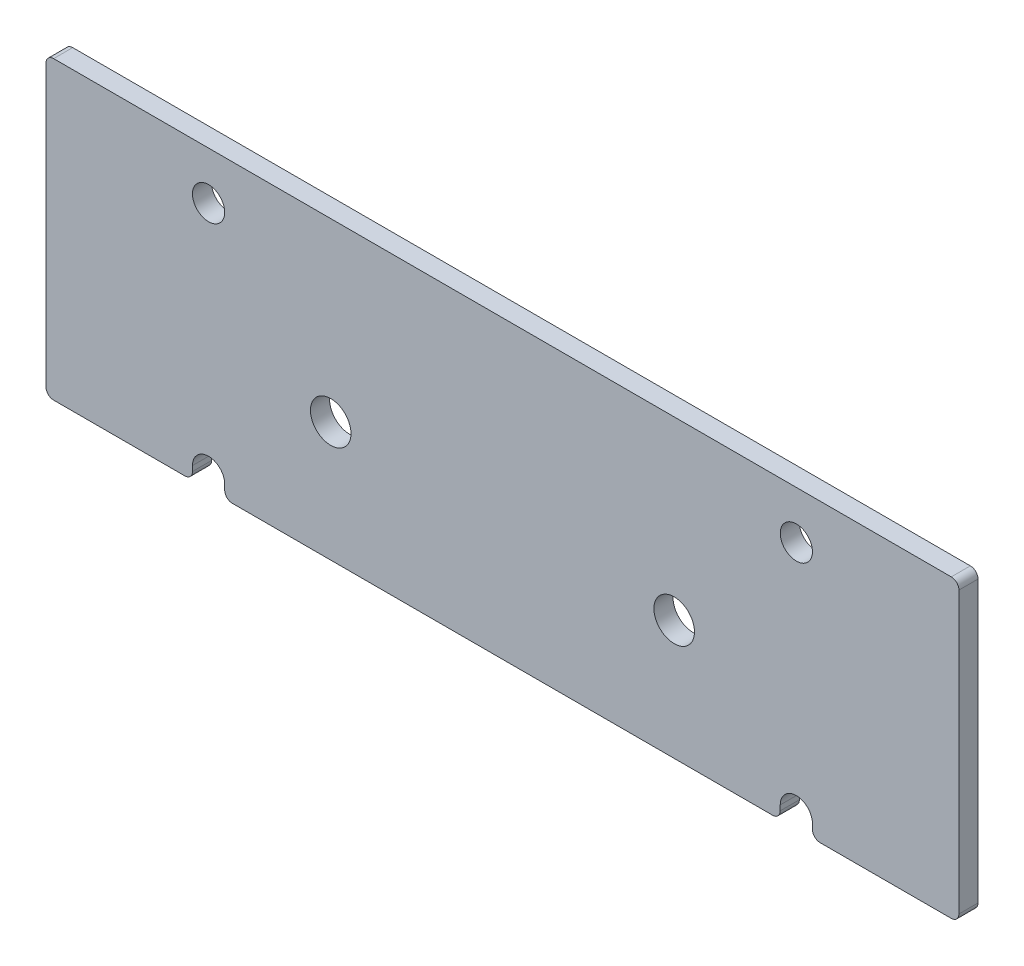
ISO-10303-21;
HEADER;
FILE_DESCRIPTION(('STEP AP214'),'2;1');
FILE_NAME('part.step','',(''),(''),'','','');
FILE_SCHEMA(('AUTOMOTIVE_DESIGN { 1 0 10303 214 1 1 1 1 }'));
ENDSEC;
DATA;
#1=APPLICATION_CONTEXT('core data for automotive mechanical design processes');
#2=APPLICATION_PROTOCOL_DEFINITION('international standard','automotive_design',2000,#1);
#3=PRODUCT_CONTEXT('',#1,'mechanical');
#4=PRODUCT('Part','Part','',(#3));
#5=PRODUCT_RELATED_PRODUCT_CATEGORY('part','',(#4));
#6=PRODUCT_DEFINITION_FORMATION('','',#4);
#7=PRODUCT_DEFINITION_CONTEXT('part definition',#1,'design');
#8=PRODUCT_DEFINITION('design','',#6,#7);
#9=PRODUCT_DEFINITION_SHAPE('','',#8);
#10=(LENGTH_UNIT() NAMED_UNIT(*) SI_UNIT(.MILLI.,.METRE.));
#11=(NAMED_UNIT(*) PLANE_ANGLE_UNIT() SI_UNIT($,.RADIAN.));
#12=(NAMED_UNIT(*) SI_UNIT($,.STERADIAN.) SOLID_ANGLE_UNIT());
#13=UNCERTAINTY_MEASURE_WITH_UNIT(LENGTH_MEASURE(1.E-05),#10,'distance_accuracy_value','');
#14=(GEOMETRIC_REPRESENTATION_CONTEXT(3) GLOBAL_UNCERTAINTY_ASSIGNED_CONTEXT((#13)) GLOBAL_UNIT_ASSIGNED_CONTEXT((#10,
#11,#12)) REPRESENTATION_CONTEXT('',''));
#15=CARTESIAN_POINT('',(0.,0.,0.));
#16=DIRECTION('',(0.,0.,1.));
#17=DIRECTION('',(1.,0.,0.));
#18=AXIS2_PLACEMENT_3D('',#15,#16,#17);
#19=CARTESIAN_POINT('',(97.7899999999999,34.29,6.35));
#20=DIRECTION('',(0.,0.,1.));
#21=DIRECTION('',(1.,0.,0.));
#22=AXIS2_PLACEMENT_3D('',#19,#20,#21);
#23=CYLINDRICAL_SURFACE('',#22,5.35787599999999);
#24=DIRECTION('',(0.,0.,1.));
#25=VECTOR('',#24,1.);
#26=CARTESIAN_POINT('',(103.147876,34.29,0.));
#27=LINE('',#26,#25);
#28=CARTESIAN_POINT('',(103.147876,34.29,0.));
#29=VERTEX_POINT('',#28);
#30=CARTESIAN_POINT('',(103.147876,34.29,6.35));
#31=VERTEX_POINT('',#30);
#32=EDGE_CURVE('E414',#29,#31,#27,.T.);
#33=ORIENTED_EDGE('',*,*,#32,.T.);
#34=CARTESIAN_POINT('',(97.7899999999999,34.29,6.35));
#35=DIRECTION('',(0.,0.,1.));
#36=DIRECTION('',(1.,0.,0.));
#37=AXIS2_PLACEMENT_3D('',#34,#35,#36);
#38=CIRCLE('',#37,5.35787599999998);
#39=CARTESIAN_POINT('',(92.4321239999999,34.29,6.35));
#40=VERTEX_POINT('',#39);
#41=EDGE_CURVE('E247',#31,#40,#38,.T.);
#42=ORIENTED_EDGE('',*,*,#41,.T.);
#43=DIRECTION('',(0.,0.,1.));
#44=VECTOR('',#43,1.);
#45=CARTESIAN_POINT('',(92.4321239999999,34.29,0.));
#46=LINE('',#45,#44);
#47=CARTESIAN_POINT('',(92.4321239999999,34.29,0.));
#48=VERTEX_POINT('',#47);
#49=EDGE_CURVE('E233',#48,#40,#46,.T.);
#50=ORIENTED_EDGE('',*,*,#49,.F.);
#51=CARTESIAN_POINT('',(97.7899999999999,34.29,0.));
#52=DIRECTION('',(0.,0.,1.));
#53=DIRECTION('',(1.,0.,0.));
#54=AXIS2_PLACEMENT_3D('',#51,#52,#53);
#55=CIRCLE('',#54,5.357876);
#56=EDGE_CURVE('E245',#29,#48,#55,.T.);
#57=ORIENTED_EDGE('',*,*,#56,.F.);
#58=EDGE_LOOP('',(#33,#42,#50,#57));
#59=FACE_BOUND('',#58,.T.);
#60=ADVANCED_FACE('F59',(#59),#23,.F.);
#61=CARTESIAN_POINT('',(-97.7899999999998,34.29,6.35));
#62=DIRECTION('',(0.,0.,1.));
#63=DIRECTION('',(1.,0.,0.));
#64=AXIS2_PLACEMENT_3D('',#61,#62,#63);
#65=CYLINDRICAL_SURFACE('',#64,5.35787599999999);
#66=CARTESIAN_POINT('',(-97.7899999999998,34.29,6.35));
#67=DIRECTION('',(0.,0.,1.));
#68=DIRECTION('',(1.,0.,0.));
#69=AXIS2_PLACEMENT_3D('',#66,#67,#68);
#70=CIRCLE('',#69,5.35787599999998);
#71=CARTESIAN_POINT('',(-92.4321239999999,34.29,6.35));
#72=VERTEX_POINT('',#71);
#73=CARTESIAN_POINT('',(-103.147876,34.29,6.35));
#74=VERTEX_POINT('',#73);
#75=EDGE_CURVE('E524',#72,#74,#70,.T.);
#76=ORIENTED_EDGE('',*,*,#75,.T.);
#77=DIRECTION('',(0.,0.,1.));
#78=VECTOR('',#77,1.);
#79=CARTESIAN_POINT('',(-103.147876,34.29,0.));
#80=LINE('',#79,#78);
#81=CARTESIAN_POINT('',(-103.147876,34.29,0.));
#82=VERTEX_POINT('',#81);
#83=EDGE_CURVE('E488',#82,#74,#80,.T.);
#84=ORIENTED_EDGE('',*,*,#83,.F.);
#85=CARTESIAN_POINT('',(-97.7899999999998,34.29,0.));
#86=DIRECTION('',(0.,0.,1.));
#87=DIRECTION('',(1.,0.,0.));
#88=AXIS2_PLACEMENT_3D('',#85,#86,#87);
#89=CIRCLE('',#88,5.357876);
#90=CARTESIAN_POINT('',(-92.4321239999999,34.29,0.));
#91=VERTEX_POINT('',#90);
#92=EDGE_CURVE('E519',#91,#82,#89,.T.);
#93=ORIENTED_EDGE('',*,*,#92,.F.);
#94=DIRECTION('',(0.,0.,1.));
#95=VECTOR('',#94,1.);
#96=CARTESIAN_POINT('',(-92.4321239999999,34.29,0.));
#97=LINE('',#96,#95);
#98=EDGE_CURVE('E502',#91,#72,#97,.T.);
#99=ORIENTED_EDGE('',*,*,#98,.T.);
#100=EDGE_LOOP('',(#76,#84,#93,#99));
#101=FACE_BOUND('',#100,.T.);
#102=ADVANCED_FACE('F609',(#101),#65,.F.);
#103=CARTESIAN_POINT('',(127.,-1.26999999999994,0.));
#104=DIRECTION('',(0.,0.,-1.));
#105=DIRECTION('',(-1.,0.,0.));
#106=AXIS2_PLACEMENT_3D('',#103,#104,#105);
#107=PLANE('',#106);
#108=DIRECTION('',(0.,-1.,0.));
#109=VECTOR('',#108,1.);
#110=CARTESIAN_POINT('',(151.892,128.458282570265,0.));
#111=LINE('',#110,#109);
#112=CARTESIAN_POINT('',(151.892,125.918282570265,0.));
#113=VERTEX_POINT('',#112);
#114=CARTESIAN_POINT('',(151.892,32.5732825702649,0.));
#115=VERTEX_POINT('',#114);
#116=EDGE_CURVE('E282',#113,#115,#111,.T.);
#117=ORIENTED_EDGE('',*,*,#116,.T.);
#118=CARTESIAN_POINT('',(149.352,32.5732825702649,0.));
#119=DIRECTION('',(0.,0.,-1.));
#120=DIRECTION('',(-1.,0.,0.));
#121=AXIS2_PLACEMENT_3D('',#118,#119,#120);
#122=CIRCLE('',#121,2.54);
#123=CARTESIAN_POINT('',(149.352,30.0332825702649,0.));
#124=VERTEX_POINT('',#123);
#125=EDGE_CURVE('E365',#115,#124,#122,.T.);
#126=ORIENTED_EDGE('',*,*,#125,.T.);
#127=DIRECTION('',(-1.,0.,0.));
#128=VECTOR('',#127,1.);
#129=CARTESIAN_POINT('',(-151.892,30.0332825702649,0.));
#130=LINE('',#129,#128);
#131=CARTESIAN_POINT('',(105.687876,30.0332825702649,0.));
#132=VERTEX_POINT('',#131);
#133=EDGE_CURVE('E423',#124,#132,#130,.T.);
#134=ORIENTED_EDGE('',*,*,#133,.T.);
#135=CARTESIAN_POINT('',(105.687876,32.5732825702649,0.));
#136=DIRECTION('',(0.,0.,-1.));
#137=DIRECTION('',(-1.,0.,0.));
#138=AXIS2_PLACEMENT_3D('',#135,#136,#137);
#139=CIRCLE('',#138,2.54);
#140=CARTESIAN_POINT('',(103.147876,32.5732825702649,0.));
#141=VERTEX_POINT('',#140);
#142=EDGE_CURVE('E351',#132,#141,#139,.T.);
#143=ORIENTED_EDGE('',*,*,#142,.T.);
#144=DIRECTION('',(0.,1.,0.));
#145=VECTOR('',#144,1.);
#146=CARTESIAN_POINT('',(103.147876,34.29,0.));
#147=LINE('',#146,#145);
#148=EDGE_CURVE('E255',#141,#29,#147,.T.);
#149=ORIENTED_EDGE('',*,*,#148,.T.);
#150=ORIENTED_EDGE('',*,*,#56,.T.);
#151=DIRECTION('',(0.,-1.,0.));
#152=VECTOR('',#151,1.);
#153=CARTESIAN_POINT('',(92.4321239999999,34.29,0.));
#154=LINE('',#153,#152);
#155=CARTESIAN_POINT('',(92.4321239999999,32.5732825702649,0.));
#156=VERTEX_POINT('',#155);
#157=EDGE_CURVE('E229',#48,#156,#154,.T.);
#158=ORIENTED_EDGE('',*,*,#157,.T.);
#159=CARTESIAN_POINT('',(89.8921239999999,32.5732825702649,0.));
#160=DIRECTION('',(0.,0.,-1.));
#161=DIRECTION('',(-1.,0.,0.));
#162=AXIS2_PLACEMENT_3D('',#159,#160,#161);
#163=CIRCLE('',#162,2.54);
#164=CARTESIAN_POINT('',(89.8921239999999,30.0332825702649,0.));
#165=VERTEX_POINT('',#164);
#166=EDGE_CURVE('E354',#156,#165,#163,.T.);
#167=ORIENTED_EDGE('',*,*,#166,.T.);
#168=CARTESIAN_POINT('',(-89.8921239999999,30.0332825702649,0.));
#169=VERTEX_POINT('',#168);
#170=EDGE_CURVE('E427',#165,#169,#130,.T.);
#171=ORIENTED_EDGE('',*,*,#170,.T.);
#172=CARTESIAN_POINT('',(-89.8921239999999,32.5732825702649,0.));
#173=DIRECTION('',(0.,0.,-1.));
#174=DIRECTION('',(-1.,0.,0.));
#175=AXIS2_PLACEMENT_3D('',#172,#173,#174);
#176=CIRCLE('',#175,2.54);
#177=CARTESIAN_POINT('',(-92.4321239999999,32.5732825702649,0.));
#178=VERTEX_POINT('',#177);
#179=EDGE_CURVE('E78',#169,#178,#176,.T.);
#180=ORIENTED_EDGE('',*,*,#179,.T.);
#181=DIRECTION('',(0.,1.,0.));
#182=VECTOR('',#181,1.);
#183=CARTESIAN_POINT('',(-92.4321239999999,34.29,0.));
#184=LINE('',#183,#182);
#185=EDGE_CURVE('E514',#178,#91,#184,.T.);
#186=ORIENTED_EDGE('',*,*,#185,.T.);
#187=ORIENTED_EDGE('',*,*,#92,.T.);
#188=DIRECTION('',(0.,-1.,0.));
#189=VECTOR('',#188,1.);
#190=CARTESIAN_POINT('',(-103.147876,34.29,0.));
#191=LINE('',#190,#189);
#192=CARTESIAN_POINT('',(-103.147876,32.5732825702649,0.));
#193=VERTEX_POINT('',#192);
#194=EDGE_CURVE('E485',#82,#193,#191,.T.);
#195=ORIENTED_EDGE('',*,*,#194,.T.);
#196=CARTESIAN_POINT('',(-105.687876,32.5732825702649,0.));
#197=DIRECTION('',(0.,0.,-1.));
#198=DIRECTION('',(-1.,0.,0.));
#199=AXIS2_PLACEMENT_3D('',#196,#197,#198);
#200=CIRCLE('',#199,2.54);
#201=CARTESIAN_POINT('',(-105.687876,30.0332825702649,0.));
#202=VERTEX_POINT('',#201);
#203=EDGE_CURVE('E359',#193,#202,#200,.T.);
#204=ORIENTED_EDGE('',*,*,#203,.T.);
#205=CARTESIAN_POINT('',(-149.352,30.0332825702649,0.));
#206=VERTEX_POINT('',#205);
#207=EDGE_CURVE('E429',#202,#206,#130,.T.);
#208=ORIENTED_EDGE('',*,*,#207,.T.);
#209=CARTESIAN_POINT('',(-149.352,32.5732825702649,0.));
#210=DIRECTION('',(0.,0.,-1.));
#211=DIRECTION('',(-1.,0.,0.));
#212=AXIS2_PLACEMENT_3D('',#209,#210,#211);
#213=CIRCLE('',#212,2.54);
#214=CARTESIAN_POINT('',(-151.892,32.5732825702649,0.));
#215=VERTEX_POINT('',#214);
#216=EDGE_CURVE('E362',#206,#215,#213,.T.);
#217=ORIENTED_EDGE('',*,*,#216,.T.);
#218=DIRECTION('',(0.,1.,0.));
#219=VECTOR('',#218,1.);
#220=CARTESIAN_POINT('',(-151.892,128.458282570265,0.));
#221=LINE('',#220,#219);
#222=CARTESIAN_POINT('',(-151.892,125.918282570265,0.));
#223=VERTEX_POINT('',#222);
#224=EDGE_CURVE('E275',#215,#223,#221,.T.);
#225=ORIENTED_EDGE('',*,*,#224,.T.);
#226=CARTESIAN_POINT('',(-149.352,125.918282570265,0.));
#227=DIRECTION('',(0.,0.,-1.));
#228=DIRECTION('',(-1.,0.,0.));
#229=AXIS2_PLACEMENT_3D('',#226,#227,#228);
#230=CIRCLE('',#229,2.54);
#231=CARTESIAN_POINT('',(-149.352,128.458282570265,0.));
#232=VERTEX_POINT('',#231);
#233=EDGE_CURVE('E292',#223,#232,#230,.T.);
#234=ORIENTED_EDGE('',*,*,#233,.T.);
#235=DIRECTION('',(-1.,0.,0.));
#236=VECTOR('',#235,1.);
#237=CARTESIAN_POINT('',(-179.07,128.458282570265,0.));
#238=LINE('',#237,#236);
#239=CARTESIAN_POINT('',(149.352,128.458282570265,0.));
#240=VERTEX_POINT('',#239);
#241=EDGE_CURVE('E278',#240,#232,#238,.T.);
#242=ORIENTED_EDGE('',*,*,#241,.F.);
#243=CARTESIAN_POINT('',(149.352,125.918282570265,0.));
#244=DIRECTION('',(0.,0.,-1.));
#245=DIRECTION('',(-1.,0.,0.));
#246=AXIS2_PLACEMENT_3D('',#243,#244,#245);
#247=CIRCLE('',#246,2.54);
#248=EDGE_CURVE('E298',#240,#113,#247,.T.);
#249=ORIENTED_EDGE('',*,*,#248,.T.);
#250=EDGE_LOOP('',(#117,#126,#134,#143,#149,#150,#158,#167,#171,#180,#186,#187,#195,#204,#208,
#217,#225,#234,#242,#249));
#251=FACE_BOUND('',#250,.T.);
#252=CARTESIAN_POINT('',(57.1500000000001,69.85,0.));
#253=DIRECTION('',(0.,0.,1.));
#254=DIRECTION('',(1.,0.,0.));
#255=AXIS2_PLACEMENT_3D('',#252,#253,#254);
#256=CIRCLE('',#255,6.74623999999999);
#257=CARTESIAN_POINT('',(63.8962400000001,69.85,0.));
#258=VERTEX_POINT('',#257);
#259=EDGE_CURVE('E553',#258,#258,#256,.T.);
#260=ORIENTED_EDGE('',*,*,#259,.T.);
#261=EDGE_LOOP('',(#260));
#262=FACE_BOUND('',#261,.T.);
#263=CARTESIAN_POINT('',(-57.1500000000001,69.85,0.));
#264=DIRECTION('',(0.,0.,1.));
#265=DIRECTION('',(1.,0.,0.));
#266=AXIS2_PLACEMENT_3D('',#263,#264,#265);
#267=CIRCLE('',#266,6.74624);
#268=CARTESIAN_POINT('',(-50.4037600000001,69.85,0.));
#269=VERTEX_POINT('',#268);
#270=EDGE_CURVE('E539',#269,#269,#267,.T.);
#271=ORIENTED_EDGE('',*,*,#270,.T.);
#272=EDGE_LOOP('',(#271));
#273=FACE_BOUND('',#272,.T.);
#274=CARTESIAN_POINT('',(-97.7899999999998,112.583282570265,0.));
#275=DIRECTION('',(0.,0.,1.));
#276=DIRECTION('',(1.,0.,0.));
#277=AXIS2_PLACEMENT_3D('',#274,#275,#276);
#278=CIRCLE('',#277,5.357876);
#279=CARTESIAN_POINT('',(-92.4321239999998,112.583282570265,0.));
#280=VERTEX_POINT('',#279);
#281=EDGE_CURVE('E267',#280,#280,#278,.T.);
#282=ORIENTED_EDGE('',*,*,#281,.T.);
#283=EDGE_LOOP('',(#282));
#284=FACE_BOUND('',#283,.T.);
#285=CARTESIAN_POINT('',(97.7899999999998,112.583282570265,0.));
#286=DIRECTION('',(0.,0.,1.));
#287=DIRECTION('',(1.,0.,0.));
#288=AXIS2_PLACEMENT_3D('',#285,#286,#287);
#289=CIRCLE('',#288,5.357876);
#290=CARTESIAN_POINT('',(103.147876,112.583282570265,0.));
#291=VERTEX_POINT('',#290);
#292=EDGE_CURVE('E264',#291,#291,#289,.T.);
#293=ORIENTED_EDGE('',*,*,#292,.T.);
#294=EDGE_LOOP('',(#293));
#295=FACE_BOUND('',#294,.T.);
#296=ADVANCED_FACE('F252',(#251,#262,#273,#284,#295),#107,.T.);
#297=CARTESIAN_POINT('',(-179.07,128.458282570265,6.35));
#298=DIRECTION('',(0.,-1.,0.));
#299=DIRECTION('',(1.,0.,0.));
#300=AXIS2_PLACEMENT_3D('',#297,#298,#299);
#301=PLANE('',#300);
#302=DIRECTION('',(-1.,0.,0.));
#303=VECTOR('',#302,1.);
#304=CARTESIAN_POINT('',(-179.07,128.458282570265,6.35));
#305=LINE('',#304,#303);
#306=CARTESIAN_POINT('',(149.352,128.458282570265,6.35));
#307=VERTEX_POINT('',#306);
#308=CARTESIAN_POINT('',(-149.352,128.458282570265,6.35));
#309=VERTEX_POINT('',#308);
#310=EDGE_CURVE('E288',#307,#309,#305,.T.);
#311=ORIENTED_EDGE('',*,*,#310,.F.);
#312=DIRECTION('',(0.,0.,1.));
#313=VECTOR('',#312,1.);
#314=CARTESIAN_POINT('',(149.352,128.458282570265,6.35));
#315=LINE('',#314,#313);
#316=EDGE_CURVE('E316',#307,#240,#315,.F.);
#317=ORIENTED_EDGE('',*,*,#316,.T.);
#318=ORIENTED_EDGE('',*,*,#241,.T.);
#319=DIRECTION('',(0.,0.,1.));
#320=VECTOR('',#319,1.);
#321=CARTESIAN_POINT('',(-149.352,128.458282570265,6.35));
#322=LINE('',#321,#320);
#323=EDGE_CURVE('E312',#232,#309,#322,.T.);
#324=ORIENTED_EDGE('',*,*,#323,.T.);
#325=EDGE_LOOP('',(#311,#317,#318,#324));
#326=FACE_BOUND('',#325,.T.);
#327=ADVANCED_FACE('F592',(#326),#301,.F.);
#328=CARTESIAN_POINT('',(127.,-1.26999999999994,6.35));
#329=DIRECTION('',(0.,0.,-1.));
#330=DIRECTION('',(-1.,0.,0.));
#331=AXIS2_PLACEMENT_3D('',#328,#329,#330);
#332=PLANE('',#331);
#333=CARTESIAN_POINT('',(57.1500000000001,69.85,6.35));
#334=DIRECTION('',(0.,0.,1.));
#335=DIRECTION('',(1.,0.,0.));
#336=AXIS2_PLACEMENT_3D('',#333,#334,#335);
#337=CIRCLE('',#336,6.74623999999999);
#338=CARTESIAN_POINT('',(63.8962400000001,69.85,6.35));
#339=VERTEX_POINT('',#338);
#340=EDGE_CURVE('E426',#339,#339,#337,.T.);
#341=ORIENTED_EDGE('',*,*,#340,.F.);
#342=EDGE_LOOP('',(#341));
#343=FACE_BOUND('',#342,.T.);
#344=CARTESIAN_POINT('',(-57.1500000000001,69.85,6.35));
#345=DIRECTION('',(0.,0.,1.));
#346=DIRECTION('',(1.,0.,0.));
#347=AXIS2_PLACEMENT_3D('',#344,#345,#346);
#348=CIRCLE('',#347,6.74624);
#349=CARTESIAN_POINT('',(-50.4037600000001,69.85,6.35));
#350=VERTEX_POINT('',#349);
#351=EDGE_CURVE('E547',#350,#350,#348,.T.);
#352=ORIENTED_EDGE('',*,*,#351,.F.);
#353=EDGE_LOOP('',(#352));
#354=FACE_BOUND('',#353,.T.);
#355=DIRECTION('',(-1.,0.,0.));
#356=VECTOR('',#355,1.);
#357=CARTESIAN_POINT('',(-151.892,30.0332825702649,6.35));
#358=LINE('',#357,#356);
#359=CARTESIAN_POINT('',(149.352,30.0332825702649,6.35));
#360=VERTEX_POINT('',#359);
#361=CARTESIAN_POINT('',(105.687876,30.0332825702649,6.35));
#362=VERTEX_POINT('',#361);
#363=EDGE_CURVE('E445',#360,#362,#358,.T.);
#364=ORIENTED_EDGE('',*,*,#363,.F.);
#365=CARTESIAN_POINT('',(149.352,32.5732825702649,6.35));
#366=DIRECTION('',(0.,0.,-1.));
#367=DIRECTION('',(-1.,0.,0.));
#368=AXIS2_PLACEMENT_3D('',#365,#366,#367);
#369=CIRCLE('',#368,2.54);
#370=CARTESIAN_POINT('',(151.892,32.5732825702649,6.35));
#371=VERTEX_POINT('',#370);
#372=EDGE_CURVE('E345',#360,#371,#369,.F.);
#373=ORIENTED_EDGE('',*,*,#372,.T.);
#374=DIRECTION('',(0.,-1.,0.));
#375=VECTOR('',#374,1.);
#376=CARTESIAN_POINT('',(151.892,128.458282570265,6.35));
#377=LINE('',#376,#375);
#378=CARTESIAN_POINT('',(151.892,125.918282570265,6.35));
#379=VERTEX_POINT('',#378);
#380=EDGE_CURVE('E274',#379,#371,#377,.T.);
#381=ORIENTED_EDGE('',*,*,#380,.F.);
#382=CARTESIAN_POINT('',(149.352,125.918282570265,6.35));
#383=DIRECTION('',(0.,0.,-1.));
#384=DIRECTION('',(-1.,0.,0.));
#385=AXIS2_PLACEMENT_3D('',#382,#383,#384);
#386=CIRCLE('',#385,2.54);
#387=EDGE_CURVE('E305',#379,#307,#386,.F.);
#388=ORIENTED_EDGE('',*,*,#387,.T.);
#389=ORIENTED_EDGE('',*,*,#310,.T.);
#390=CARTESIAN_POINT('',(-149.352,125.918282570265,6.35));
#391=DIRECTION('',(0.,0.,-1.));
#392=DIRECTION('',(-1.,0.,0.));
#393=AXIS2_PLACEMENT_3D('',#390,#391,#392);
#394=CIRCLE('',#393,2.54);
#395=CARTESIAN_POINT('',(-151.892,125.918282570265,6.35));
#396=VERTEX_POINT('',#395);
#397=EDGE_CURVE('E301',#309,#396,#394,.F.);
#398=ORIENTED_EDGE('',*,*,#397,.T.);
#399=DIRECTION('',(0.,1.,0.));
#400=VECTOR('',#399,1.);
#401=CARTESIAN_POINT('',(-151.892,128.458282570265,6.35));
#402=LINE('',#401,#400);
#403=CARTESIAN_POINT('',(-151.892,32.5732825702649,6.35));
#404=VERTEX_POINT('',#403);
#405=EDGE_CURVE('E279',#404,#396,#402,.T.);
#406=ORIENTED_EDGE('',*,*,#405,.F.);
#407=CARTESIAN_POINT('',(-149.352,32.5732825702649,6.35));
#408=DIRECTION('',(0.,0.,-1.));
#409=DIRECTION('',(-1.,0.,0.));
#410=AXIS2_PLACEMENT_3D('',#407,#408,#409);
#411=CIRCLE('',#410,2.54);
#412=CARTESIAN_POINT('',(-149.352,30.0332825702649,6.35));
#413=VERTEX_POINT('',#412);
#414=EDGE_CURVE('E342',#404,#413,#411,.F.);
#415=ORIENTED_EDGE('',*,*,#414,.T.);
#416=CARTESIAN_POINT('',(-105.687876,30.0332825702649,6.35));
#417=VERTEX_POINT('',#416);
#418=EDGE_CURVE('E450',#417,#413,#358,.T.);
#419=ORIENTED_EDGE('',*,*,#418,.F.);
#420=CARTESIAN_POINT('',(-105.687876,32.5732825702649,6.35));
#421=DIRECTION('',(0.,0.,-1.));
#422=DIRECTION('',(-1.,0.,0.));
#423=AXIS2_PLACEMENT_3D('',#420,#421,#422);
#424=CIRCLE('',#423,2.54);
#425=CARTESIAN_POINT('',(-103.147876,32.5732825702649,6.35));
#426=VERTEX_POINT('',#425);
#427=EDGE_CURVE('E339',#417,#426,#424,.F.);
#428=ORIENTED_EDGE('',*,*,#427,.T.);
#429=DIRECTION('',(0.,-1.,0.));
#430=VECTOR('',#429,1.);
#431=CARTESIAN_POINT('',(-103.147876,34.29,6.35));
#432=LINE('',#431,#430);
#433=EDGE_CURVE('E438',#74,#426,#432,.T.);
#434=ORIENTED_EDGE('',*,*,#433,.F.);
#435=ORIENTED_EDGE('',*,*,#75,.F.);
#436=DIRECTION('',(0.,1.,0.));
#437=VECTOR('',#436,1.);
#438=CARTESIAN_POINT('',(-92.4321239999999,34.29,6.35));
#439=LINE('',#438,#437);
#440=CARTESIAN_POINT('',(-92.4321239999999,32.5732825702649,6.35));
#441=VERTEX_POINT('',#440);
#442=EDGE_CURVE('E496',#441,#72,#439,.T.);
#443=ORIENTED_EDGE('',*,*,#442,.F.);
#444=CARTESIAN_POINT('',(-89.8921239999999,32.5732825702649,6.35));
#445=DIRECTION('',(0.,0.,-1.));
#446=DIRECTION('',(-1.,0.,0.));
#447=AXIS2_PLACEMENT_3D('',#444,#445,#446);
#448=CIRCLE('',#447,2.54);
#449=CARTESIAN_POINT('',(-89.8921239999999,30.0332825702649,6.35));
#450=VERTEX_POINT('',#449);
#451=EDGE_CURVE('E336',#441,#450,#448,.F.);
#452=ORIENTED_EDGE('',*,*,#451,.T.);
#453=CARTESIAN_POINT('',(89.8921239999999,30.0332825702649,6.35));
#454=VERTEX_POINT('',#453);
#455=EDGE_CURVE('E448',#454,#450,#358,.T.);
#456=ORIENTED_EDGE('',*,*,#455,.F.);
#457=CARTESIAN_POINT('',(89.8921239999999,32.5732825702649,6.35));
#458=DIRECTION('',(0.,0.,-1.));
#459=DIRECTION('',(-1.,0.,0.));
#460=AXIS2_PLACEMENT_3D('',#457,#458,#459);
#461=CIRCLE('',#460,2.54);
#462=CARTESIAN_POINT('',(92.4321239999999,32.5732825702649,6.35));
#463=VERTEX_POINT('',#462);
#464=EDGE_CURVE('E333',#454,#463,#461,.F.);
#465=ORIENTED_EDGE('',*,*,#464,.T.);
#466=DIRECTION('',(0.,-1.,0.));
#467=VECTOR('',#466,1.);
#468=CARTESIAN_POINT('',(92.4321239999999,34.29,6.35));
#469=LINE('',#468,#467);
#470=EDGE_CURVE('E239',#40,#463,#469,.T.);
#471=ORIENTED_EDGE('',*,*,#470,.F.);
#472=ORIENTED_EDGE('',*,*,#41,.F.);
#473=DIRECTION('',(0.,1.,0.));
#474=VECTOR('',#473,1.);
#475=CARTESIAN_POINT('',(103.147876,34.29,6.35));
#476=LINE('',#475,#474);
#477=CARTESIAN_POINT('',(103.147876,32.5732825702649,6.35));
#478=VERTEX_POINT('',#477);
#479=EDGE_CURVE('E249',#478,#31,#476,.T.);
#480=ORIENTED_EDGE('',*,*,#479,.F.);
#481=CARTESIAN_POINT('',(105.687876,32.5732825702649,6.35));
#482=DIRECTION('',(0.,0.,-1.));
#483=DIRECTION('',(-1.,0.,0.));
#484=AXIS2_PLACEMENT_3D('',#481,#482,#483);
#485=CIRCLE('',#484,2.54);
#486=EDGE_CURVE('E330',#478,#362,#485,.F.);
#487=ORIENTED_EDGE('',*,*,#486,.T.);
#488=EDGE_LOOP('',(#364,#373,#381,#388,#389,#398,#406,#415,#419,#428,#434,#435,#443,#452,#456,
#465,#471,#472,#480,#487));
#489=FACE_BOUND('',#488,.T.);
#490=CARTESIAN_POINT('',(-97.7899999999998,112.583282570265,6.35));
#491=DIRECTION('',(0.,0.,1.));
#492=DIRECTION('',(1.,0.,0.));
#493=AXIS2_PLACEMENT_3D('',#490,#491,#492);
#494=CIRCLE('',#493,5.35787599999998);
#495=CARTESIAN_POINT('',(-92.4321239999999,112.583282570265,6.35));
#496=VERTEX_POINT('',#495);
#497=EDGE_CURVE('E523',#496,#496,#494,.T.);
#498=ORIENTED_EDGE('',*,*,#497,.F.);
#499=EDGE_LOOP('',(#498));
#500=FACE_BOUND('',#499,.T.);
#501=CARTESIAN_POINT('',(97.7899999999998,112.583282570265,6.35));
#502=DIRECTION('',(0.,0.,1.));
#503=DIRECTION('',(1.,0.,0.));
#504=AXIS2_PLACEMENT_3D('',#501,#502,#503);
#505=CIRCLE('',#504,5.35787599999998);
#506=CARTESIAN_POINT('',(103.147876,112.583282570265,6.35));
#507=VERTEX_POINT('',#506);
#508=EDGE_CURVE('E258',#507,#507,#505,.T.);
#509=ORIENTED_EDGE('',*,*,#508,.F.);
#510=EDGE_LOOP('',(#509));
#511=FACE_BOUND('',#510,.T.);
#512=ADVANCED_FACE('F588',(#343,#354,#489,#500,#511),#332,.F.);
#513=CARTESIAN_POINT('',(151.892,128.458282570265,0.));
#514=DIRECTION('',(-1.,0.,0.));
#515=DIRECTION('',(0.,-1.,0.));
#516=AXIS2_PLACEMENT_3D('',#513,#514,#515);
#517=PLANE('',#516);
#518=ORIENTED_EDGE('',*,*,#380,.T.);
#519=DIRECTION('',(0.,0.,1.));
#520=VECTOR('',#519,1.);
#521=CARTESIAN_POINT('',(151.892,32.5732825702649,0.));
#522=LINE('',#521,#520);
#523=EDGE_CURVE('E348',#371,#115,#522,.F.);
#524=ORIENTED_EDGE('',*,*,#523,.T.);
#525=ORIENTED_EDGE('',*,*,#116,.F.);
#526=DIRECTION('',(0.,0.,1.));
#527=VECTOR('',#526,1.);
#528=CARTESIAN_POINT('',(151.892,125.918282570265,0.));
#529=LINE('',#528,#527);
#530=EDGE_CURVE('E308',#113,#379,#529,.T.);
#531=ORIENTED_EDGE('',*,*,#530,.T.);
#532=EDGE_LOOP('',(#518,#524,#525,#531));
#533=FACE_BOUND('',#532,.T.);
#534=ADVANCED_FACE('F591',(#533),#517,.F.);
#535=CARTESIAN_POINT('',(-151.892,128.458282570265,0.));
#536=DIRECTION('',(1.,0.,0.));
#537=DIRECTION('',(0.,1.,0.));
#538=AXIS2_PLACEMENT_3D('',#535,#536,#537);
#539=PLANE('',#538);
#540=ORIENTED_EDGE('',*,*,#224,.F.);
#541=DIRECTION('',(0.,0.,1.));
#542=VECTOR('',#541,1.);
#543=CARTESIAN_POINT('',(-151.892,32.5732825702649,0.));
#544=LINE('',#543,#542);
#545=EDGE_CURVE('E368',#215,#404,#544,.T.);
#546=ORIENTED_EDGE('',*,*,#545,.T.);
#547=ORIENTED_EDGE('',*,*,#405,.T.);
#548=DIRECTION('',(0.,0.,1.));
#549=VECTOR('',#548,1.);
#550=CARTESIAN_POINT('',(-151.892,125.918282570265,0.));
#551=LINE('',#550,#549);
#552=EDGE_CURVE('E319',#396,#223,#551,.F.);
#553=ORIENTED_EDGE('',*,*,#552,.T.);
#554=EDGE_LOOP('',(#540,#546,#547,#553));
#555=FACE_BOUND('',#554,.T.);
#556=ADVANCED_FACE('F598',(#555),#539,.F.);
#557=CARTESIAN_POINT('',(97.7899999999998,112.583282570265,6.35));
#558=DIRECTION('',(0.,0.,1.));
#559=DIRECTION('',(1.,0.,0.));
#560=AXIS2_PLACEMENT_3D('',#557,#558,#559);
#561=CYLINDRICAL_SURFACE('',#560,5.35787599999999);
#562=ORIENTED_EDGE('',*,*,#292,.F.);
#563=EDGE_LOOP('',(#562));
#564=FACE_BOUND('',#563,.T.);
#565=ORIENTED_EDGE('',*,*,#508,.T.);
#566=EDGE_LOOP('',(#565));
#567=FACE_BOUND('',#566,.T.);
#568=ADVANCED_FACE('F584',(#564,#567),#561,.F.);
#569=CARTESIAN_POINT('',(-97.7899999999998,112.583282570265,6.35));
#570=DIRECTION('',(0.,0.,1.));
#571=DIRECTION('',(1.,0.,0.));
#572=AXIS2_PLACEMENT_3D('',#569,#570,#571);
#573=CYLINDRICAL_SURFACE('',#572,5.35787599999999);
#574=ORIENTED_EDGE('',*,*,#281,.F.);
#575=EDGE_LOOP('',(#574));
#576=FACE_BOUND('',#575,.T.);
#577=ORIENTED_EDGE('',*,*,#497,.T.);
#578=EDGE_LOOP('',(#577));
#579=FACE_BOUND('',#578,.T.);
#580=ADVANCED_FACE('F580',(#576,#579),#573,.F.);
#581=CARTESIAN_POINT('',(149.352,125.918282570265,0.));
#582=DIRECTION('',(0.,0.,1.));
#583=DIRECTION('',(1.,0.,0.));
#584=AXIS2_PLACEMENT_3D('',#581,#582,#583);
#585=CYLINDRICAL_SURFACE('',#584,2.54);
#586=ORIENTED_EDGE('',*,*,#248,.F.);
#587=ORIENTED_EDGE('',*,*,#316,.F.);
#588=ORIENTED_EDGE('',*,*,#387,.F.);
#589=ORIENTED_EDGE('',*,*,#530,.F.);
#590=EDGE_LOOP('',(#586,#587,#588,#589));
#591=FACE_BOUND('',#590,.T.);
#592=ADVANCED_FACE('F583',(#591),#585,.T.);
#593=CARTESIAN_POINT('',(-149.352,125.918282570265,6.35));
#594=DIRECTION('',(0.,0.,1.));
#595=DIRECTION('',(1.,0.,0.));
#596=AXIS2_PLACEMENT_3D('',#593,#594,#595);
#597=CYLINDRICAL_SURFACE('',#596,2.54);
#598=ORIENTED_EDGE('',*,*,#233,.F.);
#599=ORIENTED_EDGE('',*,*,#552,.F.);
#600=ORIENTED_EDGE('',*,*,#397,.F.);
#601=ORIENTED_EDGE('',*,*,#323,.F.);
#602=EDGE_LOOP('',(#598,#599,#600,#601));
#603=FACE_BOUND('',#602,.T.);
#604=ADVANCED_FACE('F620',(#603),#597,.T.);
#605=CARTESIAN_POINT('',(-57.1500000000001,69.85,6.35));
#606=DIRECTION('',(0.,0.,1.));
#607=DIRECTION('',(1.,0.,0.));
#608=AXIS2_PLACEMENT_3D('',#605,#606,#607);
#609=CYLINDRICAL_SURFACE('',#608,6.74624);
#610=ORIENTED_EDGE('',*,*,#270,.F.);
#611=EDGE_LOOP('',(#610));
#612=FACE_BOUND('',#611,.T.);
#613=ORIENTED_EDGE('',*,*,#351,.T.);
#614=EDGE_LOOP('',(#613));
#615=FACE_BOUND('',#614,.T.);
#616=ADVANCED_FACE('F616',(#612,#615),#609,.F.);
#617=CARTESIAN_POINT('',(57.1500000000001,69.85,6.35));
#618=DIRECTION('',(0.,0.,1.));
#619=DIRECTION('',(1.,0.,0.));
#620=AXIS2_PLACEMENT_3D('',#617,#618,#619);
#621=CYLINDRICAL_SURFACE('',#620,6.74623999999999);
#622=ORIENTED_EDGE('',*,*,#259,.F.);
#623=EDGE_LOOP('',(#622));
#624=FACE_BOUND('',#623,.T.);
#625=ORIENTED_EDGE('',*,*,#340,.T.);
#626=EDGE_LOOP('',(#625));
#627=FACE_BOUND('',#626,.T.);
#628=ADVANCED_FACE('F619',(#624,#627),#621,.F.);
#629=CARTESIAN_POINT('',(-151.892,30.0332825702649,0.));
#630=DIRECTION('',(0.,1.,0.));
#631=DIRECTION('',(0.,0.,1.));
#632=AXIS2_PLACEMENT_3D('',#629,#630,#631);
#633=PLANE('',#632);
#634=ORIENTED_EDGE('',*,*,#455,.T.);
#635=DIRECTION('',(0.,0.,1.));
#636=VECTOR('',#635,1.);
#637=CARTESIAN_POINT('',(-89.8921239999999,30.0332825702649,0.));
#638=LINE('',#637,#636);
#639=EDGE_CURVE('E88',#450,#169,#638,.F.);
#640=ORIENTED_EDGE('',*,*,#639,.T.);
#641=ORIENTED_EDGE('',*,*,#170,.F.);
#642=DIRECTION('',(0.,0.,1.));
#643=VECTOR('',#642,1.);
#644=CARTESIAN_POINT('',(89.8921239999999,30.0332825702649,0.));
#645=LINE('',#644,#643);
#646=EDGE_CURVE('E386',#165,#454,#645,.T.);
#647=ORIENTED_EDGE('',*,*,#646,.T.);
#648=EDGE_LOOP('',(#634,#640,#641,#647));
#649=FACE_BOUND('',#648,.T.);
#650=ADVANCED_FACE('F624',(#649),#633,.F.);
#651=ORIENTED_EDGE('',*,*,#418,.T.);
#652=DIRECTION('',(0.,0.,1.));
#653=VECTOR('',#652,1.);
#654=CARTESIAN_POINT('',(-149.352,30.0332825702649,0.));
#655=LINE('',#654,#653);
#656=EDGE_CURVE('E376',#413,#206,#655,.F.);
#657=ORIENTED_EDGE('',*,*,#656,.T.);
#658=ORIENTED_EDGE('',*,*,#207,.F.);
#659=DIRECTION('',(0.,0.,1.));
#660=VECTOR('',#659,1.);
#661=CARTESIAN_POINT('',(-105.687876,30.0332825702649,0.));
#662=LINE('',#661,#660);
#663=EDGE_CURVE('E372',#202,#417,#662,.T.);
#664=ORIENTED_EDGE('',*,*,#663,.T.);
#665=EDGE_LOOP('',(#651,#657,#658,#664));
#666=FACE_BOUND('',#665,.T.);
#667=ADVANCED_FACE('F628',(#666),#633,.F.);
#668=ORIENTED_EDGE('',*,*,#133,.F.);
#669=DIRECTION('',(0.,0.,1.));
#670=VECTOR('',#669,1.);
#671=CARTESIAN_POINT('',(149.352,30.0332825702649,0.));
#672=LINE('',#671,#670);
#673=EDGE_CURVE('E326',#124,#360,#672,.T.);
#674=ORIENTED_EDGE('',*,*,#673,.T.);
#675=ORIENTED_EDGE('',*,*,#363,.T.);
#676=DIRECTION('',(0.,0.,1.));
#677=VECTOR('',#676,1.);
#678=CARTESIAN_POINT('',(105.687876,30.0332825702649,0.));
#679=LINE('',#678,#677);
#680=EDGE_CURVE('E323',#362,#132,#679,.F.);
#681=ORIENTED_EDGE('',*,*,#680,.T.);
#682=EDGE_LOOP('',(#668,#674,#675,#681));
#683=FACE_BOUND('',#682,.T.);
#684=ADVANCED_FACE('F629',(#683),#633,.F.);
#685=CARTESIAN_POINT('',(103.147876,34.29,0.));
#686=DIRECTION('',(1.,0.,0.));
#687=DIRECTION('',(0.,0.,-1.));
#688=AXIS2_PLACEMENT_3D('',#685,#686,#687);
#689=PLANE('',#688);
#690=ORIENTED_EDGE('',*,*,#148,.F.);
#691=DIRECTION('',(0.,0.,1.));
#692=VECTOR('',#691,1.);
#693=CARTESIAN_POINT('',(103.147876,32.5732825702649,0.));
#694=LINE('',#693,#692);
#695=EDGE_CURVE('E12',#141,#478,#694,.T.);
#696=ORIENTED_EDGE('',*,*,#695,.T.);
#697=ORIENTED_EDGE('',*,*,#479,.T.);
#698=ORIENTED_EDGE('',*,*,#32,.F.);
#699=EDGE_LOOP('',(#690,#696,#697,#698));
#700=FACE_BOUND('',#699,.T.);
#701=ADVANCED_FACE('F635',(#700),#689,.F.);
#702=CARTESIAN_POINT('',(-103.147876,34.29,0.));
#703=DIRECTION('',(-1.,0.,0.));
#704=DIRECTION('',(0.,0.,1.));
#705=AXIS2_PLACEMENT_3D('',#702,#703,#704);
#706=PLANE('',#705);
#707=ORIENTED_EDGE('',*,*,#433,.T.);
#708=DIRECTION('',(0.,0.,1.));
#709=VECTOR('',#708,1.);
#710=CARTESIAN_POINT('',(-103.147876,32.5732825702649,0.));
#711=LINE('',#710,#709);
#712=EDGE_CURVE('E379',#426,#193,#711,.F.);
#713=ORIENTED_EDGE('',*,*,#712,.T.);
#714=ORIENTED_EDGE('',*,*,#194,.F.);
#715=ORIENTED_EDGE('',*,*,#83,.T.);
#716=EDGE_LOOP('',(#707,#713,#714,#715));
#717=FACE_BOUND('',#716,.T.);
#718=ADVANCED_FACE('F633',(#717),#706,.F.);
#719=CARTESIAN_POINT('',(-92.4321239999999,34.29,0.));
#720=DIRECTION('',(1.,0.,0.));
#721=DIRECTION('',(0.,0.,-1.));
#722=AXIS2_PLACEMENT_3D('',#719,#720,#721);
#723=PLANE('',#722);
#724=ORIENTED_EDGE('',*,*,#185,.F.);
#725=DIRECTION('',(0.,0.,1.));
#726=VECTOR('',#725,1.);
#727=CARTESIAN_POINT('',(-92.4321239999999,32.5732825702649,0.));
#728=LINE('',#727,#726);
#729=EDGE_CURVE('E382',#178,#441,#728,.T.);
#730=ORIENTED_EDGE('',*,*,#729,.T.);
#731=ORIENTED_EDGE('',*,*,#442,.T.);
#732=ORIENTED_EDGE('',*,*,#98,.F.);
#733=EDGE_LOOP('',(#724,#730,#731,#732));
#734=FACE_BOUND('',#733,.T.);
#735=ADVANCED_FACE('F630',(#734),#723,.F.);
#736=CARTESIAN_POINT('',(92.4321239999999,34.29,0.));
#737=DIRECTION('',(-1.,0.,0.));
#738=DIRECTION('',(0.,0.,1.));
#739=AXIS2_PLACEMENT_3D('',#736,#737,#738);
#740=PLANE('',#739);
#741=ORIENTED_EDGE('',*,*,#470,.T.);
#742=DIRECTION('',(0.,0.,1.));
#743=VECTOR('',#742,1.);
#744=CARTESIAN_POINT('',(92.4321239999999,32.5732825702649,0.));
#745=LINE('',#744,#743);
#746=EDGE_CURVE('E68',#463,#156,#745,.F.);
#747=ORIENTED_EDGE('',*,*,#746,.T.);
#748=ORIENTED_EDGE('',*,*,#157,.F.);
#749=ORIENTED_EDGE('',*,*,#49,.T.);
#750=EDGE_LOOP('',(#741,#747,#748,#749));
#751=FACE_BOUND('',#750,.T.);
#752=ADVANCED_FACE('F232',(#751),#740,.F.);
#753=CARTESIAN_POINT('',(149.352,32.5732825702649,0.));
#754=DIRECTION('',(0.,0.,1.));
#755=DIRECTION('',(1.,0.,0.));
#756=AXIS2_PLACEMENT_3D('',#753,#754,#755);
#757=CYLINDRICAL_SURFACE('',#756,2.54);
#758=ORIENTED_EDGE('',*,*,#125,.F.);
#759=ORIENTED_EDGE('',*,*,#523,.F.);
#760=ORIENTED_EDGE('',*,*,#372,.F.);
#761=ORIENTED_EDGE('',*,*,#673,.F.);
#762=EDGE_LOOP('',(#758,#759,#760,#761));
#763=FACE_BOUND('',#762,.T.);
#764=ADVANCED_FACE('F643',(#763),#757,.T.);
#765=CARTESIAN_POINT('',(-149.352,32.5732825702649,0.));
#766=DIRECTION('',(0.,0.,1.));
#767=DIRECTION('',(1.,0.,0.));
#768=AXIS2_PLACEMENT_3D('',#765,#766,#767);
#769=CYLINDRICAL_SURFACE('',#768,2.54);
#770=ORIENTED_EDGE('',*,*,#216,.F.);
#771=ORIENTED_EDGE('',*,*,#656,.F.);
#772=ORIENTED_EDGE('',*,*,#414,.F.);
#773=ORIENTED_EDGE('',*,*,#545,.F.);
#774=EDGE_LOOP('',(#770,#771,#772,#773));
#775=FACE_BOUND('',#774,.T.);
#776=ADVANCED_FACE('F647',(#775),#769,.T.);
#777=CARTESIAN_POINT('',(-105.687876,32.5732825702649,0.));
#778=DIRECTION('',(0.,0.,1.));
#779=DIRECTION('',(1.,0.,0.));
#780=AXIS2_PLACEMENT_3D('',#777,#778,#779);
#781=CYLINDRICAL_SURFACE('',#780,2.54);
#782=ORIENTED_EDGE('',*,*,#203,.F.);
#783=ORIENTED_EDGE('',*,*,#712,.F.);
#784=ORIENTED_EDGE('',*,*,#427,.F.);
#785=ORIENTED_EDGE('',*,*,#663,.F.);
#786=EDGE_LOOP('',(#782,#783,#784,#785));
#787=FACE_BOUND('',#786,.T.);
#788=ADVANCED_FACE('F653',(#787),#781,.T.);
#789=CARTESIAN_POINT('',(-89.8921239999999,32.5732825702649,0.));
#790=DIRECTION('',(0.,0.,1.));
#791=DIRECTION('',(1.,0.,0.));
#792=AXIS2_PLACEMENT_3D('',#789,#790,#791);
#793=CYLINDRICAL_SURFACE('',#792,2.54);
#794=ORIENTED_EDGE('',*,*,#179,.F.);
#795=ORIENTED_EDGE('',*,*,#639,.F.);
#796=ORIENTED_EDGE('',*,*,#451,.F.);
#797=ORIENTED_EDGE('',*,*,#729,.F.);
#798=EDGE_LOOP('',(#794,#795,#796,#797));
#799=FACE_BOUND('',#798,.T.);
#800=ADVANCED_FACE('F662',(#799),#793,.T.);
#801=CARTESIAN_POINT('',(89.8921239999999,32.5732825702649,0.));
#802=DIRECTION('',(0.,0.,1.));
#803=DIRECTION('',(1.,0.,0.));
#804=AXIS2_PLACEMENT_3D('',#801,#802,#803);
#805=CYLINDRICAL_SURFACE('',#804,2.54);
#806=ORIENTED_EDGE('',*,*,#166,.F.);
#807=ORIENTED_EDGE('',*,*,#746,.F.);
#808=ORIENTED_EDGE('',*,*,#464,.F.);
#809=ORIENTED_EDGE('',*,*,#646,.F.);
#810=EDGE_LOOP('',(#806,#807,#808,#809));
#811=FACE_BOUND('',#810,.T.);
#812=ADVANCED_FACE('F665',(#811),#805,.T.);
#813=CARTESIAN_POINT('',(105.687876,32.5732825702649,0.));
#814=DIRECTION('',(0.,0.,1.));
#815=DIRECTION('',(1.,0.,0.));
#816=AXIS2_PLACEMENT_3D('',#813,#814,#815);
#817=CYLINDRICAL_SURFACE('',#816,2.54);
#818=ORIENTED_EDGE('',*,*,#142,.F.);
#819=ORIENTED_EDGE('',*,*,#680,.F.);
#820=ORIENTED_EDGE('',*,*,#486,.F.);
#821=ORIENTED_EDGE('',*,*,#695,.F.);
#822=EDGE_LOOP('',(#818,#819,#820,#821));
#823=FACE_BOUND('',#822,.T.);
#824=ADVANCED_FACE('F61',(#823),#817,.T.);
#825=CLOSED_SHELL('',(#60,#102,#296,#327,#512,#534,#556,#568,#580,#592,#604,#616,#628,#650,#667,
#684,#701,#718,#735,#752,#764,#776,#788,#800,#812,#824));
#826=MANIFOLD_SOLID_BREP('B2',#825);
#827=ADVANCED_BREP_SHAPE_REPRESENTATION('',(#18,#826),#14);
#828=SHAPE_DEFINITION_REPRESENTATION(#9,#827);
ENDSEC;
END-ISO-10303-21;
